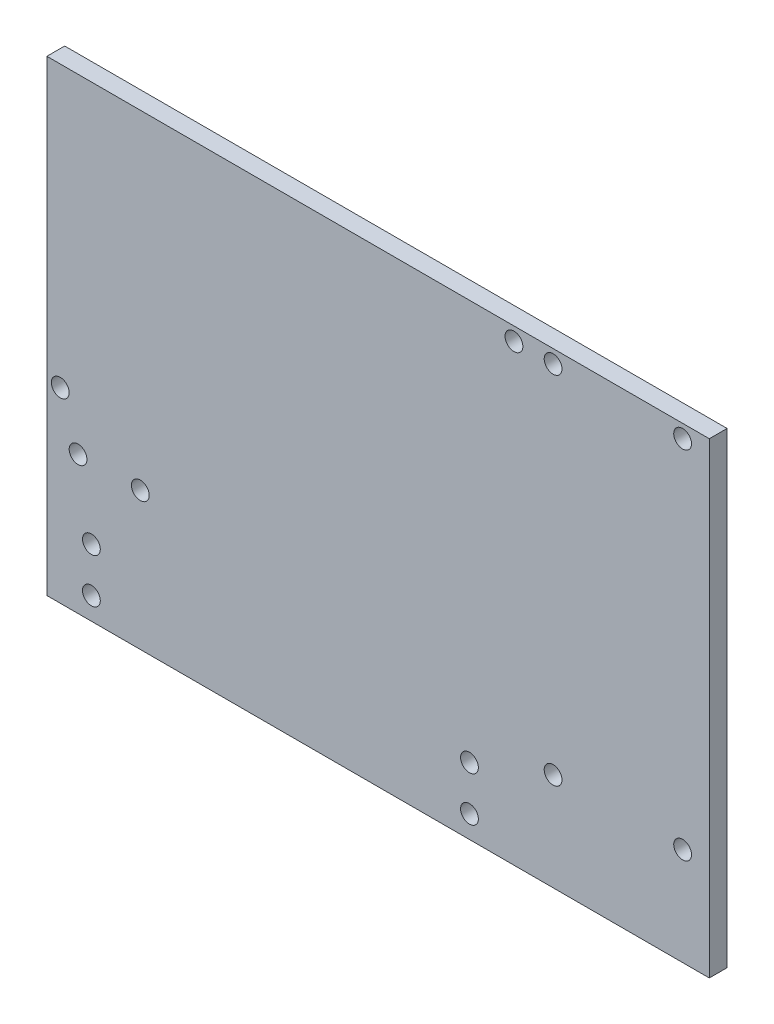
ISO-10303-21;
HEADER;
FILE_DESCRIPTION(('STEP AP214'),'2;1');
FILE_NAME('part.step','',(''),(''),'','','');
FILE_SCHEMA(('AUTOMOTIVE_DESIGN { 1 0 10303 214 1 1 1 1 }'));
ENDSEC;
DATA;
#1=APPLICATION_CONTEXT('core data for automotive mechanical design processes');
#2=APPLICATION_PROTOCOL_DEFINITION('international standard','automotive_design',2000,#1);
#3=PRODUCT_CONTEXT('',#1,'mechanical');
#4=PRODUCT('Part','Part','',(#3));
#5=PRODUCT_RELATED_PRODUCT_CATEGORY('part','',(#4));
#6=PRODUCT_DEFINITION_FORMATION('','',#4);
#7=PRODUCT_DEFINITION_CONTEXT('part definition',#1,'design');
#8=PRODUCT_DEFINITION('design','',#6,#7);
#9=PRODUCT_DEFINITION_SHAPE('','',#8);
#10=(LENGTH_UNIT() NAMED_UNIT(*) SI_UNIT(.MILLI.,.METRE.));
#11=(NAMED_UNIT(*) PLANE_ANGLE_UNIT() SI_UNIT($,.RADIAN.));
#12=(NAMED_UNIT(*) SI_UNIT($,.STERADIAN.) SOLID_ANGLE_UNIT());
#13=UNCERTAINTY_MEASURE_WITH_UNIT(LENGTH_MEASURE(1.E-05),#10,'distance_accuracy_value','');
#14=(GEOMETRIC_REPRESENTATION_CONTEXT(3) GLOBAL_UNCERTAINTY_ASSIGNED_CONTEXT((#13)) GLOBAL_UNIT_ASSIGNED_CONTEXT((#10,
#11,#12)) REPRESENTATION_CONTEXT('',''));
#15=CARTESIAN_POINT('',(0.,0.,0.));
#16=DIRECTION('',(0.,0.,1.));
#17=DIRECTION('',(1.,0.,0.));
#18=AXIS2_PLACEMENT_3D('',#15,#16,#17);
#19=CARTESIAN_POINT('',(0.,0.,2.));
#20=DIRECTION('',(0.,0.,-1.));
#21=DIRECTION('',(-1.,0.,0.));
#22=AXIS2_PLACEMENT_3D('',#19,#20,#21);
#23=PLANE('',#22);
#24=DIRECTION('',(0.,-1.,0.));
#25=VECTOR('',#24,1.);
#26=CARTESIAN_POINT('',(14.3554904609918,-16.,2.));
#27=LINE('',#26,#25);
#28=CARTESIAN_POINT('',(14.3554904609918,36.500000064,2.));
#29=VERTEX_POINT('',#28);
#30=CARTESIAN_POINT('',(14.3554904609918,-16.,2.));
#31=VERTEX_POINT('',#30);
#32=EDGE_CURVE('E91',#29,#31,#27,.T.);
#33=ORIENTED_EDGE('',*,*,#32,.T.);
#34=DIRECTION('',(1.,0.,0.));
#35=VECTOR('',#34,1.);
#36=CARTESIAN_POINT('',(14.3554904609918,-16.,2.));
#37=LINE('',#36,#35);
#38=CARTESIAN_POINT('',(88.8154904609924,-16.,2.));
#39=VERTEX_POINT('',#38);
#40=EDGE_CURVE('E86',#31,#39,#37,.T.);
#41=ORIENTED_EDGE('',*,*,#40,.T.);
#42=DIRECTION('',(0.,1.,0.));
#43=VECTOR('',#42,1.);
#44=CARTESIAN_POINT('',(88.8154904609924,36.500000064,2.));
#45=LINE('',#44,#43);
#46=CARTESIAN_POINT('',(88.8154904609924,36.500000064,2.));
#47=VERTEX_POINT('',#46);
#48=EDGE_CURVE('E89',#39,#47,#45,.T.);
#49=ORIENTED_EDGE('',*,*,#48,.T.);
#50=DIRECTION('',(-1.,0.,0.));
#51=VECTOR('',#50,1.);
#52=CARTESIAN_POINT('',(14.3554904609918,36.500000064,2.));
#53=LINE('',#52,#51);
#54=EDGE_CURVE('E56',#47,#29,#53,.T.);
#55=ORIENTED_EDGE('',*,*,#54,.T.);
#56=EDGE_LOOP('',(#33,#41,#49,#55));
#57=FACE_BOUND('',#56,.T.);
#58=CARTESIAN_POINT('',(71.2554904609918,-5.00000019114576,2.));
#59=DIRECTION('',(0.,0.,1.));
#60=DIRECTION('',(1.,0.,0.));
#61=AXIS2_PLACEMENT_3D('',#58,#59,#60);
#62=CIRCLE('',#61,1.);
#63=CARTESIAN_POINT('',(72.2554904609918,-5.00000019114576,2.));
#64=VERTEX_POINT('',#63);
#65=EDGE_CURVE('E106',#64,#64,#62,.T.);
#66=ORIENTED_EDGE('',*,*,#65,.F.);
#67=EDGE_LOOP('',(#66));
#68=FACE_BOUND('',#67,.T.);
#69=CARTESIAN_POINT('',(19.3554904609918,-13.5,2.));
#70=DIRECTION('',(0.,0.,1.));
#71=DIRECTION('',(1.,0.,0.));
#72=AXIS2_PLACEMENT_3D('',#69,#70,#71);
#73=CIRCLE('',#72,1.);
#74=CARTESIAN_POINT('',(20.3554904609918,-13.5,2.));
#75=VERTEX_POINT('',#74);
#76=EDGE_CURVE('E121',#75,#75,#73,.T.);
#77=ORIENTED_EDGE('',*,*,#76,.F.);
#78=EDGE_LOOP('',(#77));
#79=FACE_BOUND('',#78,.T.);
#80=CARTESIAN_POINT('',(19.3554904609918,-8.5,2.));
#81=DIRECTION('',(0.,0.,1.));
#82=DIRECTION('',(1.,0.,0.));
#83=AXIS2_PLACEMENT_3D('',#80,#81,#82);
#84=CIRCLE('',#83,1.);
#85=CARTESIAN_POINT('',(20.3554904609918,-8.5,2.));
#86=VERTEX_POINT('',#85);
#87=EDGE_CURVE('E127',#86,#86,#84,.T.);
#88=ORIENTED_EDGE('',*,*,#87,.F.);
#89=EDGE_LOOP('',(#88));
#90=FACE_BOUND('',#89,.T.);
#91=CARTESIAN_POINT('',(17.8554904609918,-0.499999936000005,2.));
#92=DIRECTION('',(0.,0.,1.));
#93=DIRECTION('',(1.,0.,0.));
#94=AXIS2_PLACEMENT_3D('',#91,#92,#93);
#95=CIRCLE('',#94,1.);
#96=CARTESIAN_POINT('',(18.8554904609918,-0.499999936000005,2.));
#97=VERTEX_POINT('',#96);
#98=EDGE_CURVE('E133',#97,#97,#95,.T.);
#99=ORIENTED_EDGE('',*,*,#98,.F.);
#100=EDGE_LOOP('',(#99));
#101=FACE_BOUND('',#100,.T.);
#102=CARTESIAN_POINT('',(24.8554904609918,-0.499999936000005,2.));
#103=DIRECTION('',(0.,0.,1.));
#104=DIRECTION('',(1.,0.,0.));
#105=AXIS2_PLACEMENT_3D('',#102,#103,#104);
#106=CIRCLE('',#105,1.);
#107=CARTESIAN_POINT('',(25.8554904609918,-0.499999936000005,2.));
#108=VERTEX_POINT('',#107);
#109=EDGE_CURVE('E139',#108,#108,#106,.T.);
#110=ORIENTED_EDGE('',*,*,#109,.F.);
#111=EDGE_LOOP('',(#110));
#112=FACE_BOUND('',#111,.T.);
#113=CARTESIAN_POINT('',(61.855490460992,-13.5,2.));
#114=DIRECTION('',(0.,0.,1.));
#115=DIRECTION('',(1.,0.,0.));
#116=AXIS2_PLACEMENT_3D('',#113,#114,#115);
#117=CIRCLE('',#116,0.999999999999997);
#118=CARTESIAN_POINT('',(62.855490460992,-13.5,2.));
#119=VERTEX_POINT('',#118);
#120=EDGE_CURVE('E145',#119,#119,#117,.T.);
#121=ORIENTED_EDGE('',*,*,#120,.F.);
#122=EDGE_LOOP('',(#121));
#123=FACE_BOUND('',#122,.T.);
#124=CARTESIAN_POINT('',(61.855490460992,-8.49999999999999,2.));
#125=DIRECTION('',(0.,0.,1.));
#126=DIRECTION('',(1.,0.,0.));
#127=AXIS2_PLACEMENT_3D('',#124,#125,#126);
#128=CIRCLE('',#127,0.999999999999997);
#129=CARTESIAN_POINT('',(62.855490460992,-8.49999999999999,2.));
#130=VERTEX_POINT('',#129);
#131=EDGE_CURVE('E151',#130,#130,#128,.T.);
#132=ORIENTED_EDGE('',*,*,#131,.F.);
#133=EDGE_LOOP('',(#132));
#134=FACE_BOUND('',#133,.T.);
#135=CARTESIAN_POINT('',(71.2554904609918,35.000000064,2.));
#136=DIRECTION('',(0.,0.,1.));
#137=DIRECTION('',(1.,0.,0.));
#138=AXIS2_PLACEMENT_3D('',#135,#136,#137);
#139=CIRCLE('',#138,1.);
#140=CARTESIAN_POINT('',(72.2554904609918,35.000000064,2.));
#141=VERTEX_POINT('',#140);
#142=EDGE_CURVE('E157',#141,#141,#139,.T.);
#143=ORIENTED_EDGE('',*,*,#142,.F.);
#144=EDGE_LOOP('',(#143));
#145=FACE_BOUND('',#144,.T.);
#146=CARTESIAN_POINT('',(66.8554904609918,35.000000064,2.));
#147=DIRECTION('',(0.,0.,1.));
#148=DIRECTION('',(1.,0.,0.));
#149=AXIS2_PLACEMENT_3D('',#146,#147,#148);
#150=CIRCLE('',#149,0.999999999999998);
#151=CARTESIAN_POINT('',(67.8554904609918,35.000000064,2.));
#152=VERTEX_POINT('',#151);
#153=EDGE_CURVE('E163',#152,#152,#150,.T.);
#154=ORIENTED_EDGE('',*,*,#153,.F.);
#155=EDGE_LOOP('',(#154));
#156=FACE_BOUND('',#155,.T.);
#157=CARTESIAN_POINT('',(15.8554904609918,5.000000064,2.));
#158=DIRECTION('',(0.,0.,1.));
#159=DIRECTION('',(1.,0.,0.));
#160=AXIS2_PLACEMENT_3D('',#157,#158,#159);
#161=CIRCLE('',#160,0.999999999999998);
#162=CARTESIAN_POINT('',(16.8554904609918,5.000000064,2.));
#163=VERTEX_POINT('',#162);
#164=EDGE_CURVE('E169',#163,#163,#161,.T.);
#165=ORIENTED_EDGE('',*,*,#164,.F.);
#166=EDGE_LOOP('',(#165));
#167=FACE_BOUND('',#166,.T.);
#168=CARTESIAN_POINT('',(85.8154904609924,35.000000064,2.));
#169=DIRECTION('',(0.,0.,1.));
#170=DIRECTION('',(1.,0.,0.));
#171=AXIS2_PLACEMENT_3D('',#168,#169,#170);
#172=CIRCLE('',#171,0.999999999999403);
#173=CARTESIAN_POINT('',(86.8154904609918,35.000000064,2.));
#174=VERTEX_POINT('',#173);
#175=EDGE_CURVE('E175',#174,#174,#172,.T.);
#176=ORIENTED_EDGE('',*,*,#175,.F.);
#177=EDGE_LOOP('',(#176));
#178=FACE_BOUND('',#177,.T.);
#179=CARTESIAN_POINT('',(85.8154904609924,-5.00000019114576,2.));
#180=DIRECTION('',(0.,0.,1.));
#181=DIRECTION('',(1.,0.,0.));
#182=AXIS2_PLACEMENT_3D('',#179,#180,#181);
#183=CIRCLE('',#182,0.999999999999416);
#184=CARTESIAN_POINT('',(86.8154904609919,-5.00000019114576,2.));
#185=VERTEX_POINT('',#184);
#186=EDGE_CURVE('E181',#185,#185,#183,.T.);
#187=ORIENTED_EDGE('',*,*,#186,.F.);
#188=EDGE_LOOP('',(#187));
#189=FACE_BOUND('',#188,.T.);
#190=ADVANCED_FACE('F39',(#57,#68,#79,#90,#101,#112,#123,#134,#145,#156,#167,#178,#189),#23,.F.);
#191=CARTESIAN_POINT('',(0.,0.,0.));
#192=DIRECTION('',(0.,0.,-1.));
#193=DIRECTION('',(-1.,0.,0.));
#194=AXIS2_PLACEMENT_3D('',#191,#192,#193);
#195=PLANE('',#194);
#196=CARTESIAN_POINT('',(85.8154904609924,35.000000064,0.));
#197=DIRECTION('',(0.,0.,1.));
#198=DIRECTION('',(1.,0.,0.));
#199=AXIS2_PLACEMENT_3D('',#196,#197,#198);
#200=CIRCLE('',#199,0.999999999999403);
#201=CARTESIAN_POINT('',(86.8154904609918,35.000000064,0.));
#202=VERTEX_POINT('',#201);
#203=EDGE_CURVE('E178',#202,#202,#200,.T.);
#204=ORIENTED_EDGE('',*,*,#203,.T.);
#205=EDGE_LOOP('',(#204));
#206=FACE_BOUND('',#205,.T.);
#207=CARTESIAN_POINT('',(66.8554904609918,35.000000064,0.));
#208=DIRECTION('',(0.,0.,1.));
#209=DIRECTION('',(1.,0.,0.));
#210=AXIS2_PLACEMENT_3D('',#207,#208,#209);
#211=CIRCLE('',#210,0.999999999999998);
#212=CARTESIAN_POINT('',(67.8554904609918,35.000000064,0.));
#213=VERTEX_POINT('',#212);
#214=EDGE_CURVE('E166',#213,#213,#211,.T.);
#215=ORIENTED_EDGE('',*,*,#214,.T.);
#216=EDGE_LOOP('',(#215));
#217=FACE_BOUND('',#216,.T.);
#218=CARTESIAN_POINT('',(61.855490460992,-8.49999999999999,0.));
#219=DIRECTION('',(0.,0.,1.));
#220=DIRECTION('',(1.,0.,0.));
#221=AXIS2_PLACEMENT_3D('',#218,#219,#220);
#222=CIRCLE('',#221,0.999999999999997);
#223=CARTESIAN_POINT('',(62.855490460992,-8.49999999999999,0.));
#224=VERTEX_POINT('',#223);
#225=EDGE_CURVE('E154',#224,#224,#222,.T.);
#226=ORIENTED_EDGE('',*,*,#225,.T.);
#227=EDGE_LOOP('',(#226));
#228=FACE_BOUND('',#227,.T.);
#229=CARTESIAN_POINT('',(24.8554904609918,-0.499999936000005,0.));
#230=DIRECTION('',(0.,0.,1.));
#231=DIRECTION('',(1.,0.,0.));
#232=AXIS2_PLACEMENT_3D('',#229,#230,#231);
#233=CIRCLE('',#232,1.);
#234=CARTESIAN_POINT('',(25.8554904609918,-0.499999936000005,0.));
#235=VERTEX_POINT('',#234);
#236=EDGE_CURVE('E142',#235,#235,#233,.T.);
#237=ORIENTED_EDGE('',*,*,#236,.T.);
#238=EDGE_LOOP('',(#237));
#239=FACE_BOUND('',#238,.T.);
#240=CARTESIAN_POINT('',(19.3554904609918,-8.5,0.));
#241=DIRECTION('',(0.,0.,1.));
#242=DIRECTION('',(1.,0.,0.));
#243=AXIS2_PLACEMENT_3D('',#240,#241,#242);
#244=CIRCLE('',#243,1.);
#245=CARTESIAN_POINT('',(20.3554904609918,-8.5,0.));
#246=VERTEX_POINT('',#245);
#247=EDGE_CURVE('E130',#246,#246,#244,.T.);
#248=ORIENTED_EDGE('',*,*,#247,.T.);
#249=EDGE_LOOP('',(#248));
#250=FACE_BOUND('',#249,.T.);
#251=CARTESIAN_POINT('',(71.2554904609918,-5.00000019114576,0.));
#252=DIRECTION('',(0.,0.,1.));
#253=DIRECTION('',(1.,0.,0.));
#254=AXIS2_PLACEMENT_3D('',#251,#252,#253);
#255=CIRCLE('',#254,1.);
#256=CARTESIAN_POINT('',(72.2554904609918,-5.00000019114576,0.));
#257=VERTEX_POINT('',#256);
#258=EDGE_CURVE('E118',#257,#257,#255,.T.);
#259=ORIENTED_EDGE('',*,*,#258,.T.);
#260=EDGE_LOOP('',(#259));
#261=FACE_BOUND('',#260,.T.);
#262=DIRECTION('',(0.,-1.,0.));
#263=VECTOR('',#262,1.);
#264=CARTESIAN_POINT('',(14.3554904609918,-16.,0.));
#265=LINE('',#264,#263);
#266=CARTESIAN_POINT('',(14.3554904609918,36.500000064,0.));
#267=VERTEX_POINT('',#266);
#268=CARTESIAN_POINT('',(14.3554904609918,-16.,0.));
#269=VERTEX_POINT('',#268);
#270=EDGE_CURVE('E103',#267,#269,#265,.T.);
#271=ORIENTED_EDGE('',*,*,#270,.F.);
#272=DIRECTION('',(-1.,0.,0.));
#273=VECTOR('',#272,1.);
#274=CARTESIAN_POINT('',(14.3554904609918,36.500000064,0.));
#275=LINE('',#274,#273);
#276=CARTESIAN_POINT('',(88.8154904609924,36.500000064,0.));
#277=VERTEX_POINT('',#276);
#278=EDGE_CURVE('E79',#277,#267,#275,.T.);
#279=ORIENTED_EDGE('',*,*,#278,.F.);
#280=DIRECTION('',(0.,1.,0.));
#281=VECTOR('',#280,1.);
#282=CARTESIAN_POINT('',(88.8154904609924,36.500000064,0.));
#283=LINE('',#282,#281);
#284=CARTESIAN_POINT('',(88.8154904609924,-16.,0.));
#285=VERTEX_POINT('',#284);
#286=EDGE_CURVE('E73',#285,#277,#283,.T.);
#287=ORIENTED_EDGE('',*,*,#286,.F.);
#288=DIRECTION('',(1.,0.,0.));
#289=VECTOR('',#288,1.);
#290=CARTESIAN_POINT('',(14.3554904609918,-16.,0.));
#291=LINE('',#290,#289);
#292=EDGE_CURVE('E95',#269,#285,#291,.T.);
#293=ORIENTED_EDGE('',*,*,#292,.F.);
#294=EDGE_LOOP('',(#271,#279,#287,#293));
#295=FACE_BOUND('',#294,.T.);
#296=CARTESIAN_POINT('',(19.3554904609918,-13.5,0.));
#297=DIRECTION('',(0.,0.,1.));
#298=DIRECTION('',(1.,0.,0.));
#299=AXIS2_PLACEMENT_3D('',#296,#297,#298);
#300=CIRCLE('',#299,1.);
#301=CARTESIAN_POINT('',(20.3554904609918,-13.5,0.));
#302=VERTEX_POINT('',#301);
#303=EDGE_CURVE('E124',#302,#302,#300,.T.);
#304=ORIENTED_EDGE('',*,*,#303,.T.);
#305=EDGE_LOOP('',(#304));
#306=FACE_BOUND('',#305,.T.);
#307=CARTESIAN_POINT('',(17.8554904609918,-0.499999936000005,0.));
#308=DIRECTION('',(0.,0.,1.));
#309=DIRECTION('',(1.,0.,0.));
#310=AXIS2_PLACEMENT_3D('',#307,#308,#309);
#311=CIRCLE('',#310,1.);
#312=CARTESIAN_POINT('',(18.8554904609918,-0.499999936000005,0.));
#313=VERTEX_POINT('',#312);
#314=EDGE_CURVE('E136',#313,#313,#311,.T.);
#315=ORIENTED_EDGE('',*,*,#314,.T.);
#316=EDGE_LOOP('',(#315));
#317=FACE_BOUND('',#316,.T.);
#318=CARTESIAN_POINT('',(61.855490460992,-13.5,0.));
#319=DIRECTION('',(0.,0.,1.));
#320=DIRECTION('',(1.,0.,0.));
#321=AXIS2_PLACEMENT_3D('',#318,#319,#320);
#322=CIRCLE('',#321,0.999999999999997);
#323=CARTESIAN_POINT('',(62.855490460992,-13.5,0.));
#324=VERTEX_POINT('',#323);
#325=EDGE_CURVE('E148',#324,#324,#322,.T.);
#326=ORIENTED_EDGE('',*,*,#325,.T.);
#327=EDGE_LOOP('',(#326));
#328=FACE_BOUND('',#327,.T.);
#329=CARTESIAN_POINT('',(71.2554904609918,35.000000064,0.));
#330=DIRECTION('',(0.,0.,1.));
#331=DIRECTION('',(1.,0.,0.));
#332=AXIS2_PLACEMENT_3D('',#329,#330,#331);
#333=CIRCLE('',#332,1.);
#334=CARTESIAN_POINT('',(72.2554904609918,35.000000064,0.));
#335=VERTEX_POINT('',#334);
#336=EDGE_CURVE('E160',#335,#335,#333,.T.);
#337=ORIENTED_EDGE('',*,*,#336,.T.);
#338=EDGE_LOOP('',(#337));
#339=FACE_BOUND('',#338,.T.);
#340=CARTESIAN_POINT('',(15.8554904609918,5.000000064,0.));
#341=DIRECTION('',(0.,0.,1.));
#342=DIRECTION('',(1.,0.,0.));
#343=AXIS2_PLACEMENT_3D('',#340,#341,#342);
#344=CIRCLE('',#343,0.999999999999998);
#345=CARTESIAN_POINT('',(16.8554904609918,5.000000064,0.));
#346=VERTEX_POINT('',#345);
#347=EDGE_CURVE('E172',#346,#346,#344,.T.);
#348=ORIENTED_EDGE('',*,*,#347,.T.);
#349=EDGE_LOOP('',(#348));
#350=FACE_BOUND('',#349,.T.);
#351=CARTESIAN_POINT('',(85.8154904609924,-5.00000019114576,0.));
#352=DIRECTION('',(0.,0.,1.));
#353=DIRECTION('',(1.,0.,0.));
#354=AXIS2_PLACEMENT_3D('',#351,#352,#353);
#355=CIRCLE('',#354,0.999999999999416);
#356=CARTESIAN_POINT('',(86.8154904609919,-5.00000019114576,0.));
#357=VERTEX_POINT('',#356);
#358=EDGE_CURVE('E184',#357,#357,#355,.T.);
#359=ORIENTED_EDGE('',*,*,#358,.T.);
#360=EDGE_LOOP('',(#359));
#361=FACE_BOUND('',#360,.T.);
#362=ADVANCED_FACE('F114',(#206,#217,#228,#239,#250,#261,#295,#306,#317,#328,#339,#350,#361),
#195,.T.);
#363=CARTESIAN_POINT('',(14.3554904609918,-16.,2.));
#364=DIRECTION('',(1.,0.,0.));
#365=DIRECTION('',(0.,0.,-1.));
#366=AXIS2_PLACEMENT_3D('',#363,#364,#365);
#367=PLANE('',#366);
#368=ORIENTED_EDGE('',*,*,#270,.T.);
#369=DIRECTION('',(0.,0.,-1.));
#370=VECTOR('',#369,1.);
#371=CARTESIAN_POINT('',(14.3554904609918,-16.,2.));
#372=LINE('',#371,#370);
#373=EDGE_CURVE('E11',#31,#269,#372,.T.);
#374=ORIENTED_EDGE('',*,*,#373,.F.);
#375=ORIENTED_EDGE('',*,*,#32,.F.);
#376=DIRECTION('',(0.,0.,-1.));
#377=VECTOR('',#376,1.);
#378=CARTESIAN_POINT('',(14.3554904609918,36.500000064,2.));
#379=LINE('',#378,#377);
#380=EDGE_CURVE('E99',#29,#267,#379,.T.);
#381=ORIENTED_EDGE('',*,*,#380,.T.);
#382=EDGE_LOOP('',(#368,#374,#375,#381));
#383=FACE_BOUND('',#382,.T.);
#384=ADVANCED_FACE('F41',(#383),#367,.F.);
#385=CARTESIAN_POINT('',(14.3554904609918,-16.,2.));
#386=DIRECTION('',(0.,1.,0.));
#387=DIRECTION('',(0.,0.,1.));
#388=AXIS2_PLACEMENT_3D('',#385,#386,#387);
#389=PLANE('',#388);
#390=ORIENTED_EDGE('',*,*,#292,.T.);
#391=DIRECTION('',(0.,0.,-1.));
#392=VECTOR('',#391,1.);
#393=CARTESIAN_POINT('',(88.8154904609924,-16.,2.));
#394=LINE('',#393,#392);
#395=EDGE_CURVE('E48',#39,#285,#394,.T.);
#396=ORIENTED_EDGE('',*,*,#395,.F.);
#397=ORIENTED_EDGE('',*,*,#40,.F.);
#398=ORIENTED_EDGE('',*,*,#373,.T.);
#399=EDGE_LOOP('',(#390,#396,#397,#398));
#400=FACE_BOUND('',#399,.T.);
#401=ADVANCED_FACE('F94',(#400),#389,.F.);
#402=CARTESIAN_POINT('',(88.8154904609924,36.500000064,2.));
#403=DIRECTION('',(-1.,0.,0.));
#404=DIRECTION('',(0.,0.,1.));
#405=AXIS2_PLACEMENT_3D('',#402,#403,#404);
#406=PLANE('',#405);
#407=ORIENTED_EDGE('',*,*,#286,.T.);
#408=DIRECTION('',(0.,0.,-1.));
#409=VECTOR('',#408,1.);
#410=CARTESIAN_POINT('',(88.8154904609924,36.500000064,2.));
#411=LINE('',#410,#409);
#412=EDGE_CURVE('E96',#47,#277,#411,.T.);
#413=ORIENTED_EDGE('',*,*,#412,.F.);
#414=ORIENTED_EDGE('',*,*,#48,.F.);
#415=ORIENTED_EDGE('',*,*,#395,.T.);
#416=EDGE_LOOP('',(#407,#413,#414,#415));
#417=FACE_BOUND('',#416,.T.);
#418=ADVANCED_FACE('F97',(#417),#406,.F.);
#419=CARTESIAN_POINT('',(14.3554904609918,36.500000064,2.));
#420=DIRECTION('',(0.,-1.,0.));
#421=DIRECTION('',(1.,0.,0.));
#422=AXIS2_PLACEMENT_3D('',#419,#420,#421);
#423=PLANE('',#422);
#424=ORIENTED_EDGE('',*,*,#278,.T.);
#425=ORIENTED_EDGE('',*,*,#380,.F.);
#426=ORIENTED_EDGE('',*,*,#54,.F.);
#427=ORIENTED_EDGE('',*,*,#412,.T.);
#428=EDGE_LOOP('',(#424,#425,#426,#427));
#429=FACE_BOUND('',#428,.T.);
#430=ADVANCED_FACE('F111',(#429),#423,.F.);
#431=CARTESIAN_POINT('',(71.2554904609918,-5.00000019114576,2.));
#432=DIRECTION('',(0.,0.,-1.));
#433=DIRECTION('',(-1.,0.,0.));
#434=AXIS2_PLACEMENT_3D('',#431,#432,#433);
#435=CYLINDRICAL_SURFACE('',#434,1.);
#436=ORIENTED_EDGE('',*,*,#258,.F.);
#437=EDGE_LOOP('',(#436));
#438=FACE_BOUND('',#437,.T.);
#439=ORIENTED_EDGE('',*,*,#65,.T.);
#440=EDGE_LOOP('',(#439));
#441=FACE_BOUND('',#440,.T.);
#442=ADVANCED_FACE('F201',(#438,#441),#435,.F.);
#443=CARTESIAN_POINT('',(19.3554904609918,-13.5,2.));
#444=DIRECTION('',(0.,0.,-1.));
#445=DIRECTION('',(-1.,0.,0.));
#446=AXIS2_PLACEMENT_3D('',#443,#444,#445);
#447=CYLINDRICAL_SURFACE('',#446,1.);
#448=ORIENTED_EDGE('',*,*,#303,.F.);
#449=EDGE_LOOP('',(#448));
#450=FACE_BOUND('',#449,.T.);
#451=ORIENTED_EDGE('',*,*,#76,.T.);
#452=EDGE_LOOP('',(#451));
#453=FACE_BOUND('',#452,.T.);
#454=ADVANCED_FACE('F246',(#450,#453),#447,.F.);
#455=CARTESIAN_POINT('',(19.3554904609918,-8.5,2.));
#456=DIRECTION('',(0.,0.,-1.));
#457=DIRECTION('',(-1.,0.,0.));
#458=AXIS2_PLACEMENT_3D('',#455,#456,#457);
#459=CYLINDRICAL_SURFACE('',#458,1.);
#460=ORIENTED_EDGE('',*,*,#247,.F.);
#461=EDGE_LOOP('',(#460));
#462=FACE_BOUND('',#461,.T.);
#463=ORIENTED_EDGE('',*,*,#87,.T.);
#464=EDGE_LOOP('',(#463));
#465=FACE_BOUND('',#464,.T.);
#466=ADVANCED_FACE('F255',(#462,#465),#459,.F.);
#467=CARTESIAN_POINT('',(17.8554904609918,-0.499999936000005,2.));
#468=DIRECTION('',(0.,0.,-1.));
#469=DIRECTION('',(-1.,0.,0.));
#470=AXIS2_PLACEMENT_3D('',#467,#468,#469);
#471=CYLINDRICAL_SURFACE('',#470,1.);
#472=ORIENTED_EDGE('',*,*,#314,.F.);
#473=EDGE_LOOP('',(#472));
#474=FACE_BOUND('',#473,.T.);
#475=ORIENTED_EDGE('',*,*,#98,.T.);
#476=EDGE_LOOP('',(#475));
#477=FACE_BOUND('',#476,.T.);
#478=ADVANCED_FACE('F264',(#474,#477),#471,.F.);
#479=CARTESIAN_POINT('',(24.8554904609918,-0.499999936000005,2.));
#480=DIRECTION('',(0.,0.,-1.));
#481=DIRECTION('',(-1.,0.,0.));
#482=AXIS2_PLACEMENT_3D('',#479,#480,#481);
#483=CYLINDRICAL_SURFACE('',#482,1.);
#484=ORIENTED_EDGE('',*,*,#236,.F.);
#485=EDGE_LOOP('',(#484));
#486=FACE_BOUND('',#485,.T.);
#487=ORIENTED_EDGE('',*,*,#109,.T.);
#488=EDGE_LOOP('',(#487));
#489=FACE_BOUND('',#488,.T.);
#490=ADVANCED_FACE('F274',(#486,#489),#483,.F.);
#491=CARTESIAN_POINT('',(61.855490460992,-13.5,2.));
#492=DIRECTION('',(0.,0.,-1.));
#493=DIRECTION('',(-1.,0.,0.));
#494=AXIS2_PLACEMENT_3D('',#491,#492,#493);
#495=CYLINDRICAL_SURFACE('',#494,0.999999999999997);
#496=ORIENTED_EDGE('',*,*,#325,.F.);
#497=EDGE_LOOP('',(#496));
#498=FACE_BOUND('',#497,.T.);
#499=ORIENTED_EDGE('',*,*,#120,.T.);
#500=EDGE_LOOP('',(#499));
#501=FACE_BOUND('',#500,.T.);
#502=ADVANCED_FACE('F284',(#498,#501),#495,.F.);
#503=CARTESIAN_POINT('',(61.855490460992,-8.49999999999999,2.));
#504=DIRECTION('',(0.,0.,-1.));
#505=DIRECTION('',(-1.,0.,0.));
#506=AXIS2_PLACEMENT_3D('',#503,#504,#505);
#507=CYLINDRICAL_SURFACE('',#506,0.999999999999997);
#508=ORIENTED_EDGE('',*,*,#225,.F.);
#509=EDGE_LOOP('',(#508));
#510=FACE_BOUND('',#509,.T.);
#511=ORIENTED_EDGE('',*,*,#131,.T.);
#512=EDGE_LOOP('',(#511));
#513=FACE_BOUND('',#512,.T.);
#514=ADVANCED_FACE('F294',(#510,#513),#507,.F.);
#515=CARTESIAN_POINT('',(71.2554904609918,35.000000064,2.));
#516=DIRECTION('',(0.,0.,-1.));
#517=DIRECTION('',(-1.,0.,0.));
#518=AXIS2_PLACEMENT_3D('',#515,#516,#517);
#519=CYLINDRICAL_SURFACE('',#518,1.);
#520=ORIENTED_EDGE('',*,*,#336,.F.);
#521=EDGE_LOOP('',(#520));
#522=FACE_BOUND('',#521,.T.);
#523=ORIENTED_EDGE('',*,*,#142,.T.);
#524=EDGE_LOOP('',(#523));
#525=FACE_BOUND('',#524,.T.);
#526=ADVANCED_FACE('F304',(#522,#525),#519,.F.);
#527=CARTESIAN_POINT('',(66.8554904609918,35.000000064,2.));
#528=DIRECTION('',(0.,0.,-1.));
#529=DIRECTION('',(-1.,0.,0.));
#530=AXIS2_PLACEMENT_3D('',#527,#528,#529);
#531=CYLINDRICAL_SURFACE('',#530,0.999999999999998);
#532=ORIENTED_EDGE('',*,*,#153,.T.);
#533=EDGE_LOOP('',(#532));
#534=FACE_BOUND('',#533,.T.);
#535=ORIENTED_EDGE('',*,*,#214,.F.);
#536=EDGE_LOOP('',(#535));
#537=FACE_BOUND('',#536,.T.);
#538=ADVANCED_FACE('F314',(#534,#537),#531,.F.);
#539=CARTESIAN_POINT('',(15.8554904609918,5.000000064,2.));
#540=DIRECTION('',(0.,0.,-1.));
#541=DIRECTION('',(-1.,0.,0.));
#542=AXIS2_PLACEMENT_3D('',#539,#540,#541);
#543=CYLINDRICAL_SURFACE('',#542,0.999999999999998);
#544=ORIENTED_EDGE('',*,*,#164,.T.);
#545=EDGE_LOOP('',(#544));
#546=FACE_BOUND('',#545,.T.);
#547=ORIENTED_EDGE('',*,*,#347,.F.);
#548=EDGE_LOOP('',(#547));
#549=FACE_BOUND('',#548,.T.);
#550=ADVANCED_FACE('F324',(#546,#549),#543,.F.);
#551=CARTESIAN_POINT('',(85.8154904609924,35.000000064,2.));
#552=DIRECTION('',(0.,0.,-1.));
#553=DIRECTION('',(-1.,0.,0.));
#554=AXIS2_PLACEMENT_3D('',#551,#552,#553);
#555=CYLINDRICAL_SURFACE('',#554,0.999999999999403);
#556=ORIENTED_EDGE('',*,*,#175,.T.);
#557=EDGE_LOOP('',(#556));
#558=FACE_BOUND('',#557,.T.);
#559=ORIENTED_EDGE('',*,*,#203,.F.);
#560=EDGE_LOOP('',(#559));
#561=FACE_BOUND('',#560,.T.);
#562=ADVANCED_FACE('F333',(#558,#561),#555,.F.);
#563=CARTESIAN_POINT('',(85.8154904609924,-5.00000019114576,2.));
#564=DIRECTION('',(0.,0.,-1.));
#565=DIRECTION('',(-1.,0.,0.));
#566=AXIS2_PLACEMENT_3D('',#563,#564,#565);
#567=CYLINDRICAL_SURFACE('',#566,0.999999999999416);
#568=ORIENTED_EDGE('',*,*,#186,.T.);
#569=EDGE_LOOP('',(#568));
#570=FACE_BOUND('',#569,.T.);
#571=ORIENTED_EDGE('',*,*,#358,.F.);
#572=EDGE_LOOP('',(#571));
#573=FACE_BOUND('',#572,.T.);
#574=ADVANCED_FACE('F190',(#570,#573),#567,.F.);
#575=CLOSED_SHELL('',(#190,#362,#384,#401,#418,#430,#442,#454,#466,#478,#490,#502,#514,#526,
#538,#550,#562,#574));
#576=MANIFOLD_SOLID_BREP('B2',#575);
#577=ADVANCED_BREP_SHAPE_REPRESENTATION('',(#18,#576),#14);
#578=SHAPE_DEFINITION_REPRESENTATION(#9,#577);
ENDSEC;
END-ISO-10303-21;
